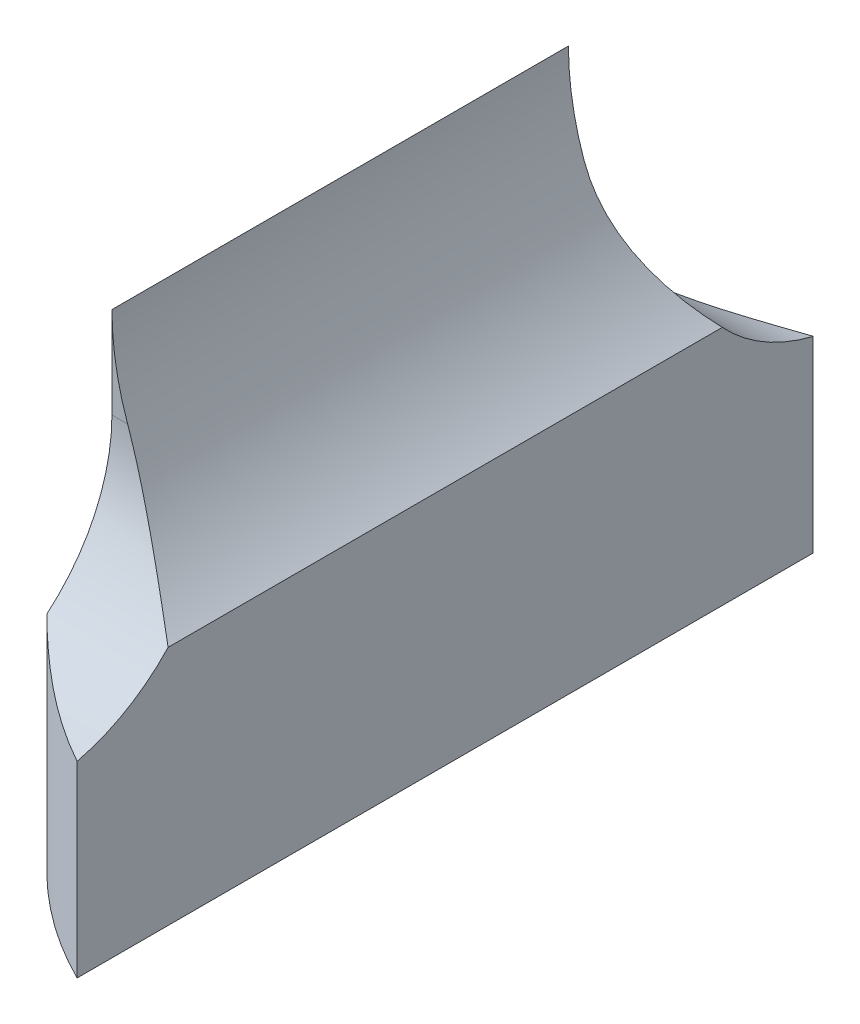
ISO-10303-21;
HEADER;
FILE_DESCRIPTION(('STEP AP214'),'2;1');
FILE_NAME('part.step','',(''),(''),'','','');
FILE_SCHEMA(('AUTOMOTIVE_DESIGN { 1 0 10303 214 1 1 1 1 }'));
ENDSEC;
DATA;
#1=APPLICATION_CONTEXT('core data for automotive mechanical design processes');
#2=APPLICATION_PROTOCOL_DEFINITION('international standard','automotive_design',2000,#1);
#3=PRODUCT_CONTEXT('',#1,'mechanical');
#4=PRODUCT('Part','Part','',(#3));
#5=PRODUCT_RELATED_PRODUCT_CATEGORY('part','',(#4));
#6=PRODUCT_DEFINITION_FORMATION('','',#4);
#7=PRODUCT_DEFINITION_CONTEXT('part definition',#1,'design');
#8=PRODUCT_DEFINITION('design','',#6,#7);
#9=PRODUCT_DEFINITION_SHAPE('','',#8);
#10=(LENGTH_UNIT() NAMED_UNIT(*) SI_UNIT(.MILLI.,.METRE.));
#11=(NAMED_UNIT(*) PLANE_ANGLE_UNIT() SI_UNIT($,.RADIAN.));
#12=(NAMED_UNIT(*) SI_UNIT($,.STERADIAN.) SOLID_ANGLE_UNIT());
#13=UNCERTAINTY_MEASURE_WITH_UNIT(LENGTH_MEASURE(1.E-05),#10,'distance_accuracy_value','');
#14=(GEOMETRIC_REPRESENTATION_CONTEXT(3) GLOBAL_UNCERTAINTY_ASSIGNED_CONTEXT((#13)) GLOBAL_UNIT_ASSIGNED_CONTEXT((#10,
#11,#12)) REPRESENTATION_CONTEXT('',''));
#15=CARTESIAN_POINT('',(0.,0.,0.));
#16=DIRECTION('',(0.,0.,1.));
#17=DIRECTION('',(1.,0.,0.));
#18=AXIS2_PLACEMENT_3D('',#15,#16,#17);
#19=CARTESIAN_POINT('',(0.,0.,0.));
#20=DIRECTION('',(0.,1.,0.));
#21=DIRECTION('',(1.,0.,0.));
#22=AXIS2_PLACEMENT_3D('',#19,#20,#21);
#23=CYLINDRICAL_SURFACE('',#22,28.575);
#24=CARTESIAN_POINT('',(-0.962642902411477,12.7000103571768,28.558780499917));
#25=CARTESIAN_POINT('',(-1.3607761503102,12.7000623405133,28.5453656938383));
#26=CARTESIAN_POINT('',(-1.75862825689124,12.7000777129765,28.5236151588992));
#27=CARTESIAN_POINT('',(-2.55307899623916,12.7004445435241,28.4635033904879));
#28=CARTESIAN_POINT('',(-2.94967761792786,12.7007960045706,28.4251420106218));
#29=CARTESIAN_POINT('',(-3.74118366921573,12.7022448100237,28.3318388404822));
#30=CARTESIAN_POINT('',(-4.13608981320455,12.7033426454376,28.2768861487445));
#31=CARTESIAN_POINT('',(-4.92324947447937,12.7069381444453,28.1505085427587));
#32=CARTESIAN_POINT('',(-5.31550300582261,12.7094358006151,28.0790837158735));
#33=CARTESIAN_POINT('',(-6.09971504116847,12.7166858056301,27.9192672118523));
#34=CARTESIAN_POINT('',(-6.49164726347514,12.7214556290704,27.8307472529649));
#35=CARTESIAN_POINT('',(-7.27137941730738,12.7342954372855,27.6372759368338));
#36=CARTESIAN_POINT('',(-7.65917937418716,12.7423654017996,27.5323246804693));
#37=CARTESIAN_POINT('',(-8.42975640725983,12.7630247664455,27.3062442784215));
#38=CARTESIAN_POINT('',(-8.81253540321093,12.7756123837614,27.1851215263719));
#39=CARTESIAN_POINT('',(-9.57240196747997,12.8067151018845,26.9269527073132));
#40=CARTESIAN_POINT('',(-9.94948990979667,12.8252298113894,26.7899076918606));
#41=CARTESIAN_POINT('',(-10.8728927575909,12.8802289715,26.4321390525996));
#42=CARTESIAN_POINT('',(-11.4154826552657,12.921069187127,26.2023507001288));
#43=CARTESIAN_POINT('',(-12.4837500266763,13.0247001334089,25.7105492113076));
#44=CARTESIAN_POINT('',(-13.0094275044079,13.0874908588779,25.4485360825706));
#45=CARTESIAN_POINT('',(-14.0386470858113,13.2413188734456,24.8955218171345));
#46=CARTESIAN_POINT('',(-14.5422624205993,13.3322531031989,24.6046290332782));
#47=CARTESIAN_POINT('',(-15.5253033019142,13.5496409172657,23.9964408297584));
#48=CARTESIAN_POINT('',(-16.0047377469772,13.6760813211805,23.6791552381827));
#49=CARTESIAN_POINT('',(-16.8002547898707,13.9292795839771,23.1180863962715));
#50=CARTESIAN_POINT('',(-17.123479171051,14.0453697562299,22.8795842100222));
#51=CARTESIAN_POINT('',(-17.7534814131752,14.302086936599,22.3942506229855));
#52=CARTESIAN_POINT('',(-18.0602635161131,14.4427075758021,22.1474213975547));
#53=CARTESIAN_POINT('',(-18.6552298763263,14.7509891906529,21.6486405827833));
#54=CARTESIAN_POINT('',(-18.9434257661055,14.9186330188448,21.3966923297248));
#55=CARTESIAN_POINT('',(-19.4993082019253,15.2832535267715,20.8913521403153));
#56=CARTESIAN_POINT('',(-19.7669984548309,15.4802248858398,20.6379604738347));
#57=CARTESIAN_POINT('',(-20.234127179903,15.8672649269102,20.1791498359509));
#58=CARTESIAN_POINT('',(-20.4372307457051,16.0523162460658,19.9732236603809));
#59=CARTESIAN_POINT('',(-20.8271119032828,16.4437967712395,19.5663328087745));
#60=CARTESIAN_POINT('',(-21.0138928922234,16.6502215092434,19.3653671066085));
#61=CARTESIAN_POINT('',(-21.3701713388694,17.0844581862883,18.9714767807794));
#62=CARTESIAN_POINT('',(-21.5396731298461,17.3122647355449,18.7785501482922));
#63=CARTESIAN_POINT('',(-21.8606787693192,17.7888329761919,18.4038644456918));
#64=CARTESIAN_POINT('',(-22.0121823832141,18.0375949406584,18.2221055211617));
#65=CARTESIAN_POINT('',(-22.2974382725321,18.5565357054144,17.871938576604));
#66=CARTESIAN_POINT('',(-22.4310835814292,18.826829320469,17.7036132443664));
#67=CARTESIAN_POINT('',(-22.6792372793652,19.386003606918,17.3845820904189));
#68=CARTESIAN_POINT('',(-22.7937450745918,19.6748848546775,17.2338768154801));
#69=CARTESIAN_POINT('',(-23.0034597025057,20.2691361978431,16.9529413254658));
#70=CARTESIAN_POINT('',(-23.0986674148253,20.5745055409741,16.8227101773097));
#71=CARTESIAN_POINT('',(-23.2697906025734,21.1992400080783,16.5852020755224));
#72=CARTESIAN_POINT('',(-23.3457083796059,21.5186034569901,16.4779223836493));
#73=CARTESIAN_POINT('',(-23.4701116509626,22.1280288861706,16.3001450750938));
#74=CARTESIAN_POINT('',(-23.5208356823848,22.4167889072298,16.2267309964581));
#75=CARTESIAN_POINT('',(-23.6076984467592,23.0008228742553,16.100096420912));
#76=CARTESIAN_POINT('',(-23.6438389597465,23.2960960205997,16.0468734595616));
#77=CARTESIAN_POINT('',(-23.7016972572096,23.8916760000383,15.9612926924242));
#78=CARTESIAN_POINT('',(-23.7233869802868,24.1919914725832,15.9289754861824));
#79=CARTESIAN_POINT('',(-23.7450719580124,24.6440955561163,15.8966136680399));
#80=CARTESIAN_POINT('',(-23.750492013807,24.7951042402366,15.8885120518578));
#81=CARTESIAN_POINT('',(-23.7577175691629,25.0974022821664,15.8777046290994));
#82=CARTESIAN_POINT('',(-23.7595230358051,25.2486916425196,15.8749988716645));
#83=CARTESIAN_POINT('',(-23.7595244060145,25.3999999989417,15.875));
#84=B_SPLINE_CURVE_WITH_KNOTS('',3,(#24,#25,#26,#27,#28,#29,#30,#31,#32,#33,#34,#35,#36,#37,#38,
#39,#40,#41,#42,#43,#44,#45,#46,#47,#48,#49,#50,#51,#52,#53,#54,#55,#56,#57,#58,#59,#60,#61,#62,
#63,#64,#65,#66,#67,#68,#69,#70,#71,#72,#73,#74,#75,#76,#77,#78,#79,#80,#81,#82,#83),
.UNSPECIFIED.,.F.,.F.,(4,2,2,2,2,2,2,2,2,2,2,2,2,2,2,2,2,2,2,2,2,2,2,2,2,2,2,2,2,4),(0.,
1.19499017100452,2.38999087385898,3.5857784773222,4.78155973885822,5.98668965465637,
7.19181217191533,8.39645962980384,9.60102757414408,11.3715014481909,13.1419749039514,
14.9060402358499,16.6694515852094,17.9228644913719,19.175952453501,20.4282483813565,
21.6803173910816,22.7094151795732,23.738298272619,24.7669227046649,25.7955605430896,
26.830107098786,27.8646857491629,28.8992172363451,29.9336252290117,30.8392539837847,
31.7447721658629,32.6520436511371,33.1058917455508,33.559743973259),.UNSPECIFIED.);
#85=CARTESIAN_POINT('',(-12.7,13.0539279019213,25.5976683508479));
#86=VERTEX_POINT('',#85);
#87=CARTESIAN_POINT('',(-20.0025,15.6754043847483,20.4066317345612));
#88=VERTEX_POINT('',#87);
#89=EDGE_CURVE('E189',#86,#88,#84,.T.);
#90=ORIENTED_EDGE('',*,*,#89,.T.);
#91=DIRECTION('',(0.,1.,0.));
#92=VECTOR('',#91,1.);
#93=CARTESIAN_POINT('',(-20.0025,0.,20.4066317345612));
#94=LINE('',#93,#92);
#95=CARTESIAN_POINT('',(-20.0025,0.,20.4066317345612));
#96=VERTEX_POINT('',#95);
#97=EDGE_CURVE('E344',#88,#96,#94,.F.);
#98=ORIENTED_EDGE('',*,*,#97,.T.);
#99=CARTESIAN_POINT('',(0.,0.,0.));
#100=DIRECTION('',(0.,1.,0.));
#101=DIRECTION('',(1.,0.,0.));
#102=AXIS2_PLACEMENT_3D('',#99,#100,#101);
#103=CIRCLE('',#102,28.575);
#104=CARTESIAN_POINT('',(-12.7,0.,25.5976683508479));
#105=VERTEX_POINT('',#104);
#106=EDGE_CURVE('E182',#96,#105,#103,.T.);
#107=ORIENTED_EDGE('',*,*,#106,.T.);
#108=DIRECTION('',(0.,1.,0.));
#109=VECTOR('',#108,1.);
#110=CARTESIAN_POINT('',(-12.7,0.,25.5976683508479));
#111=LINE('',#110,#109);
#112=EDGE_CURVE('E321',#86,#105,#111,.F.);
#113=ORIENTED_EDGE('',*,*,#112,.F.);
#114=EDGE_LOOP('',(#90,#98,#107,#113));
#115=FACE_BOUND('',#114,.T.);
#116=ADVANCED_FACE('F49',(#115),#23,.T.);
#117=CARTESIAN_POINT('',(-12.7,0.,-25.5976683508479));
#118=VERTEX_POINT('',#117);
#119=CARTESIAN_POINT('',(-20.0025,0.,-20.4066317345612));
#120=VERTEX_POINT('',#119);
#121=EDGE_CURVE('E176',#118,#120,#103,.T.);
#122=ORIENTED_EDGE('',*,*,#121,.T.);
#123=DIRECTION('',(0.,1.,0.));
#124=VECTOR('',#123,1.);
#125=CARTESIAN_POINT('',(-20.0025,0.,-20.4066317345612));
#126=LINE('',#125,#124);
#127=CARTESIAN_POINT('',(-20.0025,15.6754043847483,-20.4066317345612));
#128=VERTEX_POINT('',#127);
#129=EDGE_CURVE('E348',#120,#128,#126,.T.);
#130=ORIENTED_EDGE('',*,*,#129,.T.);
#131=CARTESIAN_POINT('',(-23.7595244060145,25.4,-15.875));
#132=CARTESIAN_POINT('',(-23.7595230142696,25.2487022879555,-15.8749989098196));
#133=CARTESIAN_POINT('',(-23.7577178144887,25.097423696676,-15.8777042643214));
#134=CARTESIAN_POINT('',(-23.7504933685242,24.7951497627849,-15.8885100236635));
#135=CARTESIAN_POINT('',(-23.7450742181246,24.6441544127726,-15.8966102855172));
#136=CARTESIAN_POINT('',(-23.7233910418275,24.1920527026428,-15.928969445265));
#137=CARTESIAN_POINT('',(-23.7017012979497,23.8917259405318,-15.9612867423953));
#138=CARTESIAN_POINT('',(-23.6438538220081,23.2962406822662,-16.0468514492215));
#139=CARTESIAN_POINT('',(-23.60772970318,23.0010718301604,-16.1000502272979));
#140=CARTESIAN_POINT('',(-23.5209125552445,22.4172670242057,-16.2266195506375));
#141=CARTESIAN_POINT('',(-23.4702195630698,22.1286310537976,-16.2999900447645));
#142=CARTESIAN_POINT('',(-23.3541507382645,21.5598874555803,-16.4658587292189));
#143=CARTESIAN_POINT('',(-23.288772385784,21.2797813007735,-16.558360202));
#144=CARTESIAN_POINT('',(-23.1432557401746,20.7300309154546,-16.7611425575633));
#145=CARTESIAN_POINT('',(-23.0631169883516,20.4603870103825,-16.871423992862));
#146=CARTESIAN_POINT('',(-22.8880672055159,19.9333086798498,-17.1081459159033));
#147=CARTESIAN_POINT('',(-22.7931576795388,19.6758730139405,-17.234584757088));
#148=CARTESIAN_POINT('',(-22.5886257001554,19.1746613085024,-17.5017972837089));
#149=CARTESIAN_POINT('',(-22.4790031380841,18.9308853698781,-17.6425710750161));
#150=CARTESIAN_POINT('',(-22.2432478358358,18.4542121469509,-17.9389237963665));
#151=CARTESIAN_POINT('',(-22.1168677311122,18.221567817231,-18.0947124536362));
#152=CARTESIAN_POINT('',(-21.84939700222,17.7726035131081,-18.4167934780995));
#153=CARTESIAN_POINT('',(-21.7083062998932,17.5562836254483,-18.5830859010984));
#154=CARTESIAN_POINT('',(-21.4118352417292,17.1405181441847,-18.9239253558157));
#155=CARTESIAN_POINT('',(-21.2564514168758,16.9410766697319,-19.0984743864364));
#156=CARTESIAN_POINT('',(-20.9319934414159,16.5593615405111,-19.4535374994589));
#157=CARTESIAN_POINT('',(-20.7629175798899,16.3770900374306,-19.6340523256567));
#158=CARTESIAN_POINT('',(-20.3949417420431,16.0130117574471,-20.0163410915228));
#159=CARTESIAN_POINT('',(-20.1947364163166,15.8329234693482,-20.2184945225331));
#160=CARTESIAN_POINT('',(-19.7797449846715,15.4928161677378,-20.624660800305));
#161=CARTESIAN_POINT('',(-19.5649582952595,15.3327979580889,-20.8286737211936));
#162=CARTESIAN_POINT('',(-19.1218490509949,15.0319651604038,-21.2361980526336));
#163=CARTESIAN_POINT('',(-18.8935245367295,14.8911533620119,-21.4397093861255));
#164=CARTESIAN_POINT('',(-18.4244445725137,14.6276369062662,-21.8441407384501));
#165=CARTESIAN_POINT('',(-18.1836865483087,14.5049360190785,-22.0450602098103));
#166=CARTESIAN_POINT('',(-17.546300866602,14.2093634427092,-22.5590272841069));
#167=CARTESIAN_POINT('',(-17.1410320137767,14.0492437570611,-22.8687645018517));
#168=CARTESIAN_POINT('',(-16.3059237756883,13.7657514987049,-23.4715381382959));
#169=CARTESIAN_POINT('',(-15.8760727075008,13.6423965747109,-23.7645664815896));
#170=CARTESIAN_POINT('',(-14.9942917455854,13.4264082227125,-24.3305798520018));
#171=CARTESIAN_POINT('',(-14.5423037935466,13.3338611557759,-24.6035068926997));
#172=CARTESIAN_POINT('',(-13.6205016758979,13.1743795036521,-25.1255478749963));
#173=CARTESIAN_POINT('',(-13.1506880067271,13.1074442057617,-25.3746624790831));
#174=CARTESIAN_POINT('',(-12.3409075205042,13.0112668771474,-25.7753823241447));
#175=CARTESIAN_POINT('',(-12.0048116040627,12.9767505730975,-25.9336338272669));
#176=CARTESIAN_POINT('',(-11.3260407943873,12.9160676090905,-26.2371801050202));
#177=CARTESIAN_POINT('',(-10.9833653839623,12.8899016083939,-26.3824738559783));
#178=CARTESIAN_POINT('',(-10.2920973648775,12.8444615573761,-26.6597469200507));
#179=CARTESIAN_POINT('',(-9.94350278078425,12.8251898572321,-26.7917216819107));
#180=CARTESIAN_POINT('',(-9.24114312836667,12.7922281061876,-27.0420210947388));
#181=CARTESIAN_POINT('',(-8.88737742413847,12.778538747844,-27.1603440507308));
#182=CARTESIAN_POINT('',(-8.17565205441353,12.7555691463201,-27.3829921609563));
#183=CARTESIAN_POINT('',(-7.81769608375231,12.7462852804137,-27.48732876561));
#184=CARTESIAN_POINT('',(-7.09795058785473,12.7310643122888,-27.6819197734936));
#185=CARTESIAN_POINT('',(-6.73616148459517,12.7251268454974,-27.7721757099638));
#186=CARTESIAN_POINT('',(-6.00945071830102,12.7156903730339,-27.9384325221616));
#187=CARTESIAN_POINT('',(-5.64453040015585,12.7121903687873,-28.0144392261471));
#188=CARTESIAN_POINT('',(-4.91201706543628,12.7068554673417,-28.1521149285236));
#189=CARTESIAN_POINT('',(-4.5444243304264,12.7050203972173,-28.2137854154262));
#190=CARTESIAN_POINT('',(-3.90933177712482,12.7027547616586,-28.307601461938));
#191=CARTESIAN_POINT('',(-3.64233615137219,12.7020758584111,-28.3431923928319));
#192=CARTESIAN_POINT('',(-3.10749045893204,12.7010739652823,-28.4068062039456));
#193=CARTESIAN_POINT('',(-2.83964055721095,12.7007509104176,-28.434830465247));
#194=CARTESIAN_POINT('',(-2.30386477833455,12.7003079880903,-28.4832409466461));
#195=CARTESIAN_POINT('',(-2.03594045219978,12.7001876613143,-28.5036443511115));
#196=CARTESIAN_POINT('',(-1.49960116382666,12.7000482247045,-28.5368890044274));
#197=CARTESIAN_POINT('',(-1.23118616348838,12.7000291230963,-28.5497296386428));
#198=CARTESIAN_POINT('',(-0.962642969131848,12.7000103571797,-28.558780497668));
#199=B_SPLINE_CURVE_WITH_KNOTS('',3,(#131,#132,#133,#134,#135,#136,#137,#138,#139,#140,#141,
#142,#143,#144,#145,#146,#147,#148,#149,#150,#151,#152,#153,#154,#155,#156,#157,#158,#159,#160,
#161,#162,#163,#164,#165,#166,#167,#168,#169,#170,#171,#172,#173,#174,#175,#176,#177,#178,#179,
#180,#181,#182,#183,#184,#185,#186,#187,#188,#189,#190,#191,#192,#193,#194,#195,#196,#197,#198),
.UNSPECIFIED.,.F.,.F.,(4,2,2,2,2,2,2,2,2,2,2,2,2,2,2,2,2,2,2,2,2,2,2,2,2,2,2,2,2,2,2,2,2,4),(0.,
0.45382005249023,0.907628077419532,1.81493094946456,2.72013319097462,3.62533313778105,
4.53068852596952,5.43607205372104,6.34136338974141,7.24666141228281,8.16723436228149,
9.0878122035875,10.008614066494,10.9295311683503,11.9387019412507,12.9479131213493,
13.9572707290704,14.9668381603044,16.5681964302884,18.1703221895733,19.7769019591028,
21.3834370188055,22.5023491187585,23.6213495355191,24.7407310422484,25.8602513795385,
26.9788495102599,28.0973257519681,29.2153435087105,30.3332451311608,31.1412193467503,
31.9490459896379,32.7550398963778,33.5610992981407),.UNSPECIFIED.);
#200=CARTESIAN_POINT('',(-12.7,13.0539279019213,-25.5976683508479));
#201=VERTEX_POINT('',#200);
#202=EDGE_CURVE('E129',#128,#201,#199,.T.);
#203=ORIENTED_EDGE('',*,*,#202,.T.);
#204=DIRECTION('',(0.,1.,0.));
#205=VECTOR('',#204,1.);
#206=CARTESIAN_POINT('',(-12.7,0.,-25.5976683508479));
#207=LINE('',#206,#205);
#208=EDGE_CURVE('E327',#118,#201,#207,.T.);
#209=ORIENTED_EDGE('',*,*,#208,.F.);
#210=EDGE_LOOP('',(#122,#130,#203,#209));
#211=FACE_BOUND('',#210,.T.);
#212=ADVANCED_FACE('F207',(#211),#23,.T.);
#213=CARTESIAN_POINT('',(-31.75,25.4,15.875));
#214=DIRECTION('',(0.,0.,-1.));
#215=DIRECTION('',(0.,1.,0.));
#216=AXIS2_PLACEMENT_3D('',#213,#214,#215);
#217=PLANE('',#216);
#218=DIRECTION('',(0.,1.,0.));
#219=VECTOR('',#218,1.);
#220=CARTESIAN_POINT('',(-20.0025,25.4,15.875));
#221=LINE('',#220,#219);
#222=CARTESIAN_POINT('',(-20.0025,25.4,15.875));
#223=VERTEX_POINT('',#222);
#224=CARTESIAN_POINT('',(-20.0025,31.75,15.875));
#225=VERTEX_POINT('',#224);
#226=EDGE_CURVE('E123',#223,#225,#221,.T.);
#227=ORIENTED_EDGE('',*,*,#226,.F.);
#228=DIRECTION('',(1.,0.,0.));
#229=VECTOR('',#228,1.);
#230=CARTESIAN_POINT('',(-31.75,25.4,15.875));
#231=LINE('',#230,#229);
#232=CARTESIAN_POINT('',(-18.9130122421383,25.4,15.875));
#233=VERTEX_POINT('',#232);
#234=EDGE_CURVE('E61',#223,#233,#231,.T.);
#235=ORIENTED_EDGE('',*,*,#234,.T.);
#236=CARTESIAN_POINT('',(-0.9525,31.75,15.875));
#237=DIRECTION('',(0.,0.,-1.));
#238=DIRECTION('',(-1.,0.,0.));
#239=AXIS2_PLACEMENT_3D('',#236,#237,#238);
#240=CIRCLE('',#239,19.05);
#241=EDGE_CURVE('E128',#233,#225,#240,.T.);
#242=ORIENTED_EDGE('',*,*,#241,.T.);
#243=EDGE_LOOP('',(#227,#235,#242));
#244=FACE_BOUND('',#243,.T.);
#245=ADVANCED_FACE('F210',(#244),#217,.F.);
#246=CARTESIAN_POINT('',(-31.75,25.4,-15.875));
#247=DIRECTION('',(0.,0.,-1.));
#248=DIRECTION('',(0.,1.,0.));
#249=AXIS2_PLACEMENT_3D('',#246,#247,#248);
#250=PLANE('',#249);
#251=DIRECTION('',(-1.,0.,0.));
#252=VECTOR('',#251,1.);
#253=CARTESIAN_POINT('',(-31.75,25.4,-15.875));
#254=LINE('',#253,#252);
#255=CARTESIAN_POINT('',(-20.0025,25.4,-15.875));
#256=VERTEX_POINT('',#255);
#257=CARTESIAN_POINT('',(-18.9130123254726,25.4,-15.875));
#258=VERTEX_POINT('',#257);
#259=EDGE_CURVE('E54',#256,#258,#254,.F.);
#260=ORIENTED_EDGE('',*,*,#259,.F.);
#261=DIRECTION('',(0.,1.,0.));
#262=VECTOR('',#261,1.);
#263=CARTESIAN_POINT('',(-20.0025,25.4,-15.875));
#264=LINE('',#263,#262);
#265=CARTESIAN_POINT('',(-20.0025,31.75,-15.875));
#266=VERTEX_POINT('',#265);
#267=EDGE_CURVE('E121',#256,#266,#264,.T.);
#268=ORIENTED_EDGE('',*,*,#267,.T.);
#269=CARTESIAN_POINT('',(-0.9525,31.75,-15.875));
#270=DIRECTION('',(0.,0.,-1.));
#271=DIRECTION('',(-1.,0.,0.));
#272=AXIS2_PLACEMENT_3D('',#269,#270,#271);
#273=CIRCLE('',#272,19.05);
#274=EDGE_CURVE('E135',#258,#266,#273,.T.);
#275=ORIENTED_EDGE('',*,*,#274,.F.);
#276=EDGE_LOOP('',(#260,#268,#275));
#277=FACE_BOUND('',#276,.T.);
#278=ADVANCED_FACE('F134',(#277),#250,.T.);
#279=CARTESIAN_POINT('',(0.,0.,0.));
#280=DIRECTION('',(0.,1.,0.));
#281=DIRECTION('',(1.,0.,0.));
#282=AXIS2_PLACEMENT_3D('',#279,#280,#281);
#283=PLANE('',#282);
#284=DIRECTION('',(0.,0.,1.));
#285=VECTOR('',#284,1.);
#286=CARTESIAN_POINT('',(-20.0025,0.,0.));
#287=LINE('',#286,#285);
#288=EDGE_CURVE('E341',#120,#96,#287,.T.);
#289=ORIENTED_EDGE('',*,*,#288,.F.);
#290=ORIENTED_EDGE('',*,*,#121,.F.);
#291=DIRECTION('',(0.,0.,1.));
#292=VECTOR('',#291,1.);
#293=CARTESIAN_POINT('',(-12.7,0.,0.));
#294=LINE('',#293,#292);
#295=EDGE_CURVE('E316',#118,#105,#294,.T.);
#296=ORIENTED_EDGE('',*,*,#295,.T.);
#297=ORIENTED_EDGE('',*,*,#106,.F.);
#298=EDGE_LOOP('',(#289,#290,#296,#297));
#299=FACE_BOUND('',#298,.T.);
#300=ADVANCED_FACE('F209',(#299),#283,.F.);
#301=CARTESIAN_POINT('',(-31.75,25.4,-28.575));
#302=DIRECTION('',(-1.,0.,0.));
#303=DIRECTION('',(0.,0.,1.));
#304=AXIS2_PLACEMENT_3D('',#301,#302,#303);
#305=CYLINDRICAL_SURFACE('',#304,12.7);
#306=CARTESIAN_POINT('',(-20.0025,25.4,-28.575));
#307=DIRECTION('',(-1.,0.,0.));
#308=DIRECTION('',(0.,0.,1.));
#309=AXIS2_PLACEMENT_3D('',#306,#307,#308);
#310=CIRCLE('',#309,12.7);
#311=EDGE_CURVE('E352',#256,#128,#310,.F.);
#312=ORIENTED_EDGE('',*,*,#311,.F.);
#313=ORIENTED_EDGE('',*,*,#259,.T.);
#314=CARTESIAN_POINT('',(-18.9130122421383,25.4,-15.875));
#315=CARTESIAN_POINT('',(-18.8626299229769,25.2648501009191,-15.8749945228661));
#316=CARTESIAN_POINT('',(-18.8117374651054,25.1298849250138,-15.8771573429258));
#317=CARTESIAN_POINT('',(-18.7129888828845,24.8726122552359,-15.885362714986));
#318=CARTESIAN_POINT('',(-18.6652633424359,24.7502429488526,-15.8910444739334));
#319=CARTESIAN_POINT('',(-18.5728517758051,24.5182218567936,-15.9051680637231));
#320=CARTESIAN_POINT('',(-18.5283205405378,24.4084888623478,-15.9132883515372));
#321=CARTESIAN_POINT('',(-18.4423351653759,24.2017289799257,-15.9312775446171));
#322=CARTESIAN_POINT('',(-18.4010636810027,24.1046023267649,-15.9408652636687));
#323=CARTESIAN_POINT('',(-18.332737558566,23.9491597405271,-15.9580041220054));
#324=CARTESIAN_POINT('',(-18.3064026932498,23.8904537723968,-15.9648951877));
#325=CARTESIAN_POINT('',(-18.2148220533025,23.6896453279496,-15.9898795381503));
#326=CARTESIAN_POINT('',(-18.1478799169468,23.5485520114732,-16.0098784715447));
#327=CARTESIAN_POINT('',(-17.9745271296334,23.1937140317017,-16.0662209641102));
#328=CARTESIAN_POINT('',(-17.8661311542425,22.9814118102274,-16.1055894384313));
#329=CARTESIAN_POINT('',(-17.677213016968,22.6278495947987,-16.1803671748363));
#330=CARTESIAN_POINT('',(-17.5985221042731,22.485053991152,-16.2131917755474));
#331=CARTESIAN_POINT('',(-17.4825834697467,22.280810625526,-16.2638321315877));
#332=CARTESIAN_POINT('',(-17.4465782515684,22.2182073375565,-16.2798648018));
#333=CARTESIAN_POINT('',(-17.2955415520123,21.9590418281949,-16.3483380529452));
#334=CARTESIAN_POINT('',(-17.1777321871281,21.7650905172421,-16.4046465050761));
#335=CARTESIAN_POINT('',(-16.933891941319,21.3792228982179,-16.5265491996352));
#336=CARTESIAN_POINT('',(-16.8077390839598,21.1874389220409,-16.592316344938));
#337=CARTESIAN_POINT('',(-16.5471954760059,20.8063578423294,-16.7330996368137));
#338=CARTESIAN_POINT('',(-16.4126852849108,20.6172053358568,-16.8082857083939));
#339=CARTESIAN_POINT('',(-16.1354166723886,20.2418488376718,-16.9678482082153));
#340=CARTESIAN_POINT('',(-15.9925419274936,20.0558010955692,-17.0523903467772));
#341=CARTESIAN_POINT('',(-15.7943243877909,19.8072234995128,-17.1725322702073));
#342=CARTESIAN_POINT('',(-15.7411441269217,19.7414405869488,-17.2050371881469));
#343=CARTESIAN_POINT('',(-15.605590742498,19.5760447005348,-17.2885425859627));
#344=CARTESIAN_POINT('',(-15.5227766023879,19.4771028292339,-17.3401605348912));
#345=CARTESIAN_POINT('',(-15.3062803037826,19.2237363609011,-17.476576771768));
#346=CARTESIAN_POINT('',(-15.1714808643224,19.0711065409569,-17.5629434471238));
#347=CARTESIAN_POINT('',(-14.8949946370949,18.7678811686966,-17.7427854327977));
#348=CARTESIAN_POINT('',(-14.7532198948846,18.6174409962304,-17.8363870023079));
#349=CARTESIAN_POINT('',(-14.4627736181019,18.3189710206741,-18.0307337617651));
#350=CARTESIAN_POINT('',(-14.3140184531897,18.1711019023561,-18.131600575423));
#351=CARTESIAN_POINT('',(-14.0096078946794,17.8781630703768,-18.3404924625315));
#352=CARTESIAN_POINT('',(-13.8538731578817,17.7332590904405,-18.4486341278337));
#353=CARTESIAN_POINT('',(-13.5355006439764,17.4466488293002,-18.6720687356838));
#354=CARTESIAN_POINT('',(-13.3727876218283,17.3051130172027,-18.7874728652152));
#355=CARTESIAN_POINT('',(-13.0404478554047,17.025645055825,-19.0254102503855));
#356=CARTESIAN_POINT('',(-12.8707495620668,16.8878877953383,-19.1480491247466));
#357=CARTESIAN_POINT('',(-12.699684634162,16.7537714435414,-19.2727028778113));
#358=B_SPLINE_CURVE_WITH_KNOTS('',3,(#314,#315,#316,#317,#318,#319,#320,#321,#322,#323,#324,
#325,#326,#327,#328,#329,#330,#331,#332,#333,#334,#335,#336,#337,#338,#339,#340,#341,#342,#343,
#344,#345,#346,#347,#348,#349,#350,#351,#352,#353,#354,#355,#356,#357),.UNSPECIFIED.,.F.,.F.,(4,
2,2,2,2,2,2,2,2,2,2,2,2,2,2,2,2,2,2,2,2,4),(0.,0.432696409251591,0.827048735313596,
1.18311250309064,1.50096365974644,1.69508401437768,2.16729713483588,2.89170022853111,
3.39052417477627,3.61244969877918,4.31353965673207,5.02963028682414,5.76128145299754,
6.50901806732695,6.78087221688671,7.19773183677689,7.86113544144173,8.54174165875014,
9.23979741535492,9.95553157723956,10.6891564646602,11.4408692376699),.UNSPECIFIED.);
#359=CARTESIAN_POINT('',(-12.6999998688532,16.7536969355882,-19.2730560022782));
#360=VERTEX_POINT('',#359);
#361=EDGE_CURVE('E142',#258,#360,#358,.T.);
#362=ORIENTED_EDGE('',*,*,#361,.T.);
#363=CARTESIAN_POINT('',(-12.7,25.4,-28.575));
#364=DIRECTION('',(-1.,0.,0.));
#365=DIRECTION('',(0.,0.,1.));
#366=AXIS2_PLACEMENT_3D('',#363,#364,#365);
#367=CIRCLE('',#366,12.7);
#368=EDGE_CURVE('E314',#360,#201,#367,.F.);
#369=ORIENTED_EDGE('',*,*,#368,.T.);
#370=ORIENTED_EDGE('',*,*,#202,.F.);
#371=EDGE_LOOP('',(#312,#313,#362,#369,#370));
#372=FACE_BOUND('',#371,.T.);
#373=ADVANCED_FACE('F51',(#372),#305,.F.);
#374=CARTESIAN_POINT('',(-31.75,25.4,28.575));
#375=DIRECTION('',(1.,0.,0.));
#376=DIRECTION('',(0.,0.,-1.));
#377=AXIS2_PLACEMENT_3D('',#374,#375,#376);
#378=CYLINDRICAL_SURFACE('',#377,12.7);
#379=CARTESIAN_POINT('',(-20.0025,25.4,28.575));
#380=DIRECTION('',(-1.,0.,0.));
#381=DIRECTION('',(0.,0.,1.));
#382=AXIS2_PLACEMENT_3D('',#379,#380,#381);
#383=CIRCLE('',#382,12.7);
#384=EDGE_CURVE('E355',#88,#223,#383,.F.);
#385=ORIENTED_EDGE('',*,*,#384,.F.);
#386=ORIENTED_EDGE('',*,*,#89,.F.);
#387=CARTESIAN_POINT('',(-12.7,25.4,28.575));
#388=DIRECTION('',(-1.,0.,0.));
#389=DIRECTION('',(0.,0.,1.));
#390=AXIS2_PLACEMENT_3D('',#387,#388,#389);
#391=CIRCLE('',#390,12.7);
#392=CARTESIAN_POINT('',(-12.7,16.7533755881532,19.2730708301743));
#393=VERTEX_POINT('',#392);
#394=EDGE_CURVE('E13',#86,#393,#391,.F.);
#395=ORIENTED_EDGE('',*,*,#394,.T.);
#396=CARTESIAN_POINT('',(-18.9130122421383,25.4,15.875));
#397=CARTESIAN_POINT('',(-18.8497340693018,25.2210118693997,15.8749983411045));
#398=CARTESIAN_POINT('',(-18.7837855333039,25.0430075911527,15.8787844217914));
#399=CARTESIAN_POINT('',(-18.6467231259065,24.6893406660285,15.8936640856254));
#400=CARTESIAN_POINT('',(-18.5756101250626,24.5136776303775,15.9047564397118));
#401=CARTESIAN_POINT('',(-18.3550106585534,23.991278727185,15.9485421390167));
#402=CARTESIAN_POINT('',(-18.1980420811135,23.6485070556184,15.9917460206988));
#403=CARTESIAN_POINT('',(-17.8676527463349,22.9797135216138,16.1031892911451));
#404=CARTESIAN_POINT('',(-17.6944137433812,22.6535576652485,16.1711719752605));
#405=CARTESIAN_POINT('',(-17.3318691136895,22.01586555251,16.3297706721651));
#406=CARTESIAN_POINT('',(-17.1425559450336,21.7043362664966,16.4203973485763));
#407=CARTESIAN_POINT('',(-16.7049293713447,21.0280349659102,16.6447801029816));
#408=CARTESIAN_POINT('',(-16.4529997706711,20.6673005932043,16.7836581871037));
#409=CARTESIAN_POINT('',(-15.9308011524718,19.9711007243284,17.0875550697262));
#410=CARTESIAN_POINT('',(-15.6605297441538,19.6356385343733,17.2525772797803));
#411=CARTESIAN_POINT('',(-15.1032750036858,18.989084751423,17.6056610309178));
#412=CARTESIAN_POINT('',(-14.8162274474123,18.6780991821814,17.7938146310689));
#413=CARTESIAN_POINT('',(-14.2288791960802,18.0819567006576,18.189230718099));
#414=CARTESIAN_POINT('',(-13.9285774483285,17.7968018454491,18.3964947242207));
#415=CARTESIAN_POINT('',(-13.1984156246132,17.1464796343369,18.9105581416618));
#416=CARTESIAN_POINT('',(-12.7633697885075,16.7930239111386,19.2248493942131));
#417=CARTESIAN_POINT('',(-11.8763082571562,16.1333859449065,19.8781349126605));
#418=CARTESIAN_POINT('',(-11.4242863569987,15.8272212003951,20.2171382545109));
#419=CARTESIAN_POINT('',(-10.5065380825637,15.2601831655952,20.9149476019626));
#420=CARTESIAN_POINT('',(-10.0407984921444,14.9993553427282,21.2737730169768));
#421=CARTESIAN_POINT('',(-9.09905108543925,14.5216811645559,22.0066302810007));
#422=CARTESIAN_POINT('',(-8.62304394915615,14.304831906457,22.3806611244225));
#423=CARTESIAN_POINT('',(-7.55969097350217,13.8713976005961,23.222326626343));
#424=CARTESIAN_POINT('',(-6.97044213906647,13.6649246374295,23.6927739133145));
#425=CARTESIAN_POINT('',(-5.78364541772904,13.312379689528,24.6459168261099));
#426=CARTESIAN_POINT('',(-5.18609478958904,13.1663281705537,25.1286165433765));
#427=CARTESIAN_POINT('',(-3.98717431390972,12.9333741588415,26.1006321479538));
#428=CARTESIAN_POINT('',(-3.38581552424748,12.8463443988912,26.5899314644817));
#429=CARTESIAN_POINT('',(-2.18085829712548,12.7300198955487,27.5720588304996));
#430=CARTESIAN_POINT('',(-1.57726149500966,12.7006890890866,28.064884482488));
#431=CARTESIAN_POINT('',(-0.966754793001582,12.7000040018608,28.5633610103794));
#432=CARTESIAN_POINT('',(-0.95962738006711,12.7000000019469,28.5691805186742));
#433=CARTESIAN_POINT('',(-0.9525,12.7,28.575));
#434=B_SPLINE_CURVE_WITH_KNOTS('',3,(#396,#397,#398,#399,#400,#401,#402,#403,#404,#405,#406,
#407,#408,#409,#410,#411,#412,#413,#414,#415,#416,#417,#418,#419,#420,#421,#422,#423,#424,#425,
#426,#427,#428,#429,#430,#431,#432,#433),.UNSPECIFIED.,.F.,.F.,(4,2,2,2,2,2,2,2,2,2,2,2,2,2,2,2,
2,2,4),(0.,0.569405310393191,1.13871485992012,2.27535004648464,3.40052983933086,
4.52624050947126,5.9083905584972,7.29072111341501,8.6787429283433,10.0668751837947,
11.9919097522487,13.917654920933,15.8453203726628,17.7728585478994,20.115464646911,
22.4588635776714,24.7971932887953,27.1340610293043,27.1616653793962),.UNSPECIFIED.);
#435=EDGE_CURVE('E149',#233,#393,#434,.T.);
#436=ORIENTED_EDGE('',*,*,#435,.F.);
#437=ORIENTED_EDGE('',*,*,#234,.F.);
#438=EDGE_LOOP('',(#385,#386,#395,#436,#437));
#439=FACE_BOUND('',#438,.T.);
#440=ADVANCED_FACE('F200',(#439),#378,.F.);
#441=CARTESIAN_POINT('',(-0.9525,31.75,103.07574));
#442=DIRECTION('',(0.,0.,-1.));
#443=DIRECTION('',(0.,-1.,0.));
#444=AXIS2_PLACEMENT_3D('',#441,#442,#443);
#445=CYLINDRICAL_SURFACE('',#444,19.05);
#446=ORIENTED_EDGE('',*,*,#435,.T.);
#447=DIRECTION('',(0.,0.,-1.));
#448=VECTOR('',#447,1.);
#449=CARTESIAN_POINT('',(-12.7,16.7533755881532,103.07574));
#450=LINE('',#449,#448);
#451=EDGE_CURVE('E69',#393,#360,#450,.T.);
#452=ORIENTED_EDGE('',*,*,#451,.T.);
#453=ORIENTED_EDGE('',*,*,#361,.F.);
#454=ORIENTED_EDGE('',*,*,#274,.T.);
#455=DIRECTION('',(0.,0.,1.));
#456=VECTOR('',#455,1.);
#457=CARTESIAN_POINT('',(-20.0025,31.75,-31.75));
#458=LINE('',#457,#456);
#459=EDGE_CURVE('E118',#225,#266,#458,.F.);
#460=ORIENTED_EDGE('',*,*,#459,.F.);
#461=ORIENTED_EDGE('',*,*,#241,.F.);
#462=EDGE_LOOP('',(#446,#452,#453,#454,#460,#461));
#463=FACE_BOUND('',#462,.T.);
#464=ADVANCED_FACE('F140',(#463),#445,.F.);
#465=CARTESIAN_POINT('',(-12.7,0.,0.));
#466=DIRECTION('',(-1.,0.,0.));
#467=DIRECTION('',(0.,0.,1.));
#468=AXIS2_PLACEMENT_3D('',#465,#466,#467);
#469=PLANE('',#468);
#470=ORIENTED_EDGE('',*,*,#208,.T.);
#471=ORIENTED_EDGE('',*,*,#368,.F.);
#472=ORIENTED_EDGE('',*,*,#451,.F.);
#473=ORIENTED_EDGE('',*,*,#394,.F.);
#474=ORIENTED_EDGE('',*,*,#112,.T.);
#475=ORIENTED_EDGE('',*,*,#295,.F.);
#476=EDGE_LOOP('',(#470,#471,#472,#473,#474,#475));
#477=FACE_BOUND('',#476,.T.);
#478=ADVANCED_FACE('F300',(#477),#469,.F.);
#479=CARTESIAN_POINT('',(-20.0025,0.,0.));
#480=DIRECTION('',(-1.,0.,0.));
#481=DIRECTION('',(0.,0.,1.));
#482=AXIS2_PLACEMENT_3D('',#479,#480,#481);
#483=PLANE('',#482);
#484=ORIENTED_EDGE('',*,*,#288,.T.);
#485=ORIENTED_EDGE('',*,*,#97,.F.);
#486=ORIENTED_EDGE('',*,*,#384,.T.);
#487=ORIENTED_EDGE('',*,*,#226,.T.);
#488=ORIENTED_EDGE('',*,*,#459,.T.);
#489=ORIENTED_EDGE('',*,*,#267,.F.);
#490=ORIENTED_EDGE('',*,*,#311,.T.);
#491=ORIENTED_EDGE('',*,*,#129,.F.);
#492=EDGE_LOOP('',(#484,#485,#486,#487,#488,#489,#490,#491));
#493=FACE_BOUND('',#492,.T.);
#494=ADVANCED_FACE('F120',(#493),#483,.T.);
#495=CLOSED_SHELL('',(#116,#212,#245,#278,#300,#373,#440,#464,#478,#494));
#496=MANIFOLD_SOLID_BREP('B2',#495);
#497=ADVANCED_BREP_SHAPE_REPRESENTATION('',(#18,#496),#14);
#498=SHAPE_DEFINITION_REPRESENTATION(#9,#497);
ENDSEC;
END-ISO-10303-21;
